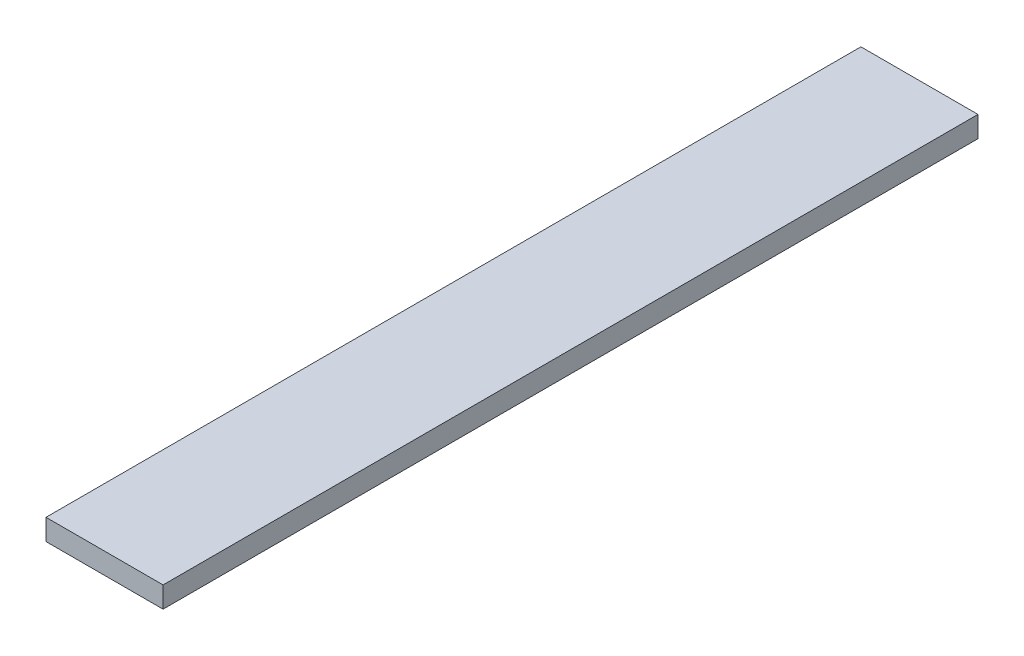
ISO-10303-21;
HEADER;
FILE_DESCRIPTION(('STEP AP214'),'2;1');
FILE_NAME('part.step','',(''),(''),'','','');
FILE_SCHEMA(('AUTOMOTIVE_DESIGN { 1 0 10303 214 1 1 1 1 }'));
ENDSEC;
DATA;
#1=APPLICATION_CONTEXT('core data for automotive mechanical design processes');
#2=APPLICATION_PROTOCOL_DEFINITION('international standard','automotive_design',2000,#1);
#3=PRODUCT_CONTEXT('',#1,'mechanical');
#4=PRODUCT('Part','Part','',(#3));
#5=PRODUCT_RELATED_PRODUCT_CATEGORY('part','',(#4));
#6=PRODUCT_DEFINITION_FORMATION('','',#4);
#7=PRODUCT_DEFINITION_CONTEXT('part definition',#1,'design');
#8=PRODUCT_DEFINITION('design','',#6,#7);
#9=PRODUCT_DEFINITION_SHAPE('','',#8);
#10=(LENGTH_UNIT() NAMED_UNIT(*) SI_UNIT(.MILLI.,.METRE.));
#11=(NAMED_UNIT(*) PLANE_ANGLE_UNIT() SI_UNIT($,.RADIAN.));
#12=(NAMED_UNIT(*) SI_UNIT($,.STERADIAN.) SOLID_ANGLE_UNIT());
#13=UNCERTAINTY_MEASURE_WITH_UNIT(LENGTH_MEASURE(1.E-05),#10,'distance_accuracy_value','');
#14=(GEOMETRIC_REPRESENTATION_CONTEXT(3) GLOBAL_UNCERTAINTY_ASSIGNED_CONTEXT((#13)) GLOBAL_UNIT_ASSIGNED_CONTEXT((#10,
#11,#12)) REPRESENTATION_CONTEXT('',''));
#15=CARTESIAN_POINT('',(0.,0.,0.));
#16=DIRECTION('',(0.,0.,1.));
#17=DIRECTION('',(1.,0.,0.));
#18=AXIS2_PLACEMENT_3D('',#15,#16,#17);
#19=CARTESIAN_POINT('',(50.8,18.25625,353.568));
#20=DIRECTION('',(-1.,0.,0.));
#21=DIRECTION('',(0.,0.,1.));
#22=AXIS2_PLACEMENT_3D('',#19,#20,#21);
#23=PLANE('',#22);
#24=DIRECTION('',(0.,0.,-1.));
#25=VECTOR('',#24,1.);
#26=CARTESIAN_POINT('',(50.8,0.,353.568));
#27=LINE('',#26,#25);
#28=CARTESIAN_POINT('',(50.8,0.,353.568));
#29=VERTEX_POINT('',#28);
#30=CARTESIAN_POINT('',(50.8,0.,-353.568));
#31=VERTEX_POINT('',#30);
#32=EDGE_CURVE('E107',#29,#31,#27,.T.);
#33=ORIENTED_EDGE('',*,*,#32,.T.);
#34=DIRECTION('',(0.,-1.,0.));
#35=VECTOR('',#34,1.);
#36=CARTESIAN_POINT('',(50.8,18.25625,-353.568));
#37=LINE('',#36,#35);
#38=CARTESIAN_POINT('',(50.8,18.25625,-353.568));
#39=VERTEX_POINT('',#38);
#40=EDGE_CURVE('E11',#39,#31,#37,.T.);
#41=ORIENTED_EDGE('',*,*,#40,.F.);
#42=DIRECTION('',(0.,0.,-1.));
#43=VECTOR('',#42,1.);
#44=CARTESIAN_POINT('',(50.8,18.25625,353.568));
#45=LINE('',#44,#43);
#46=CARTESIAN_POINT('',(50.8,18.25625,353.568));
#47=VERTEX_POINT('',#46);
#48=EDGE_CURVE('E91',#47,#39,#45,.T.);
#49=ORIENTED_EDGE('',*,*,#48,.F.);
#50=DIRECTION('',(0.,-1.,0.));
#51=VECTOR('',#50,1.);
#52=CARTESIAN_POINT('',(50.8,18.25625,353.568));
#53=LINE('',#52,#51);
#54=EDGE_CURVE('E103',#47,#29,#53,.T.);
#55=ORIENTED_EDGE('',*,*,#54,.T.);
#56=EDGE_LOOP('',(#33,#41,#49,#55));
#57=FACE_BOUND('',#56,.T.);
#58=ADVANCED_FACE('F39',(#57),#23,.F.);
#59=CARTESIAN_POINT('',(-50.8,18.25625,-353.568));
#60=DIRECTION('',(0.,0.,1.));
#61=DIRECTION('',(1.,0.,0.));
#62=AXIS2_PLACEMENT_3D('',#59,#60,#61);
#63=PLANE('',#62);
#64=DIRECTION('',(-1.,0.,0.));
#65=VECTOR('',#64,1.);
#66=CARTESIAN_POINT('',(-50.8,0.,-353.568));
#67=LINE('',#66,#65);
#68=CARTESIAN_POINT('',(-50.8,0.,-353.568));
#69=VERTEX_POINT('',#68);
#70=EDGE_CURVE('E96',#31,#69,#67,.T.);
#71=ORIENTED_EDGE('',*,*,#70,.T.);
#72=DIRECTION('',(0.,-1.,0.));
#73=VECTOR('',#72,1.);
#74=CARTESIAN_POINT('',(-50.8,18.25625,-353.568));
#75=LINE('',#74,#73);
#76=CARTESIAN_POINT('',(-50.8,18.25625,-353.568));
#77=VERTEX_POINT('',#76);
#78=EDGE_CURVE('E48',#77,#69,#75,.T.);
#79=ORIENTED_EDGE('',*,*,#78,.F.);
#80=DIRECTION('',(-1.,0.,0.));
#81=VECTOR('',#80,1.);
#82=CARTESIAN_POINT('',(-50.8,18.25625,-353.568));
#83=LINE('',#82,#81);
#84=EDGE_CURVE('E86',#39,#77,#83,.T.);
#85=ORIENTED_EDGE('',*,*,#84,.F.);
#86=ORIENTED_EDGE('',*,*,#40,.T.);
#87=EDGE_LOOP('',(#71,#79,#85,#86));
#88=FACE_BOUND('',#87,.T.);
#89=ADVANCED_FACE('F95',(#88),#63,.F.);
#90=CARTESIAN_POINT('',(-50.8,18.25625,353.568));
#91=DIRECTION('',(1.,0.,0.));
#92=DIRECTION('',(0.,0.,-1.));
#93=AXIS2_PLACEMENT_3D('',#90,#91,#92);
#94=PLANE('',#93);
#95=DIRECTION('',(0.,0.,1.));
#96=VECTOR('',#95,1.);
#97=CARTESIAN_POINT('',(-50.8,0.,353.568));
#98=LINE('',#97,#96);
#99=CARTESIAN_POINT('',(-50.8,0.,353.568));
#100=VERTEX_POINT('',#99);
#101=EDGE_CURVE('E73',#69,#100,#98,.T.);
#102=ORIENTED_EDGE('',*,*,#101,.T.);
#103=DIRECTION('',(0.,-1.,0.));
#104=VECTOR('',#103,1.);
#105=CARTESIAN_POINT('',(-50.8,18.25625,353.568));
#106=LINE('',#105,#104);
#107=CARTESIAN_POINT('',(-50.8,18.25625,353.568));
#108=VERTEX_POINT('',#107);
#109=EDGE_CURVE('E98',#108,#100,#106,.T.);
#110=ORIENTED_EDGE('',*,*,#109,.F.);
#111=DIRECTION('',(0.,0.,1.));
#112=VECTOR('',#111,1.);
#113=CARTESIAN_POINT('',(-50.8,18.25625,353.568));
#114=LINE('',#113,#112);
#115=EDGE_CURVE('E89',#77,#108,#114,.T.);
#116=ORIENTED_EDGE('',*,*,#115,.F.);
#117=ORIENTED_EDGE('',*,*,#78,.T.);
#118=EDGE_LOOP('',(#102,#110,#116,#117));
#119=FACE_BOUND('',#118,.T.);
#120=ADVANCED_FACE('F99',(#119),#94,.F.);
#121=CARTESIAN_POINT('',(-50.8,18.25625,353.568));
#122=DIRECTION('',(0.,0.,-1.));
#123=DIRECTION('',(-1.,0.,0.));
#124=AXIS2_PLACEMENT_3D('',#121,#122,#123);
#125=PLANE('',#124);
#126=DIRECTION('',(1.,0.,0.));
#127=VECTOR('',#126,1.);
#128=CARTESIAN_POINT('',(-50.8,0.,353.568));
#129=LINE('',#128,#127);
#130=EDGE_CURVE('E79',#100,#29,#129,.T.);
#131=ORIENTED_EDGE('',*,*,#130,.T.);
#132=ORIENTED_EDGE('',*,*,#54,.F.);
#133=DIRECTION('',(1.,0.,0.));
#134=VECTOR('',#133,1.);
#135=CARTESIAN_POINT('',(-50.8,18.25625,353.568));
#136=LINE('',#135,#134);
#137=EDGE_CURVE('E56',#108,#47,#136,.T.);
#138=ORIENTED_EDGE('',*,*,#137,.F.);
#139=ORIENTED_EDGE('',*,*,#109,.T.);
#140=EDGE_LOOP('',(#131,#132,#138,#139));
#141=FACE_BOUND('',#140,.T.);
#142=ADVANCED_FACE('F120',(#141),#125,.F.);
#143=CARTESIAN_POINT('',(0.,18.25625,0.));
#144=DIRECTION('',(0.,-1.,0.));
#145=DIRECTION('',(0.,0.,-1.));
#146=AXIS2_PLACEMENT_3D('',#143,#144,#145);
#147=PLANE('',#146);
#148=ORIENTED_EDGE('',*,*,#48,.T.);
#149=ORIENTED_EDGE('',*,*,#84,.T.);
#150=ORIENTED_EDGE('',*,*,#115,.T.);
#151=ORIENTED_EDGE('',*,*,#137,.T.);
#152=EDGE_LOOP('',(#148,#149,#150,#151));
#153=FACE_BOUND('',#152,.T.);
#154=ADVANCED_FACE('F87',(#153),#147,.F.);
#155=CARTESIAN_POINT('',(0.,0.,0.));
#156=DIRECTION('',(0.,-1.,0.));
#157=DIRECTION('',(0.,0.,-1.));
#158=AXIS2_PLACEMENT_3D('',#155,#156,#157);
#159=PLANE('',#158);
#160=ORIENTED_EDGE('',*,*,#32,.F.);
#161=ORIENTED_EDGE('',*,*,#130,.F.);
#162=ORIENTED_EDGE('',*,*,#101,.F.);
#163=ORIENTED_EDGE('',*,*,#70,.F.);
#164=EDGE_LOOP('',(#160,#161,#162,#163));
#165=FACE_BOUND('',#164,.T.);
#166=ADVANCED_FACE('F123',(#165),#159,.T.);
#167=CLOSED_SHELL('',(#58,#89,#120,#142,#154,#166));
#168=MANIFOLD_SOLID_BREP('B2',#167);
#169=ADVANCED_BREP_SHAPE_REPRESENTATION('',(#18,#168),#14);
#170=SHAPE_DEFINITION_REPRESENTATION(#9,#169);
ENDSEC;
END-ISO-10303-21;
